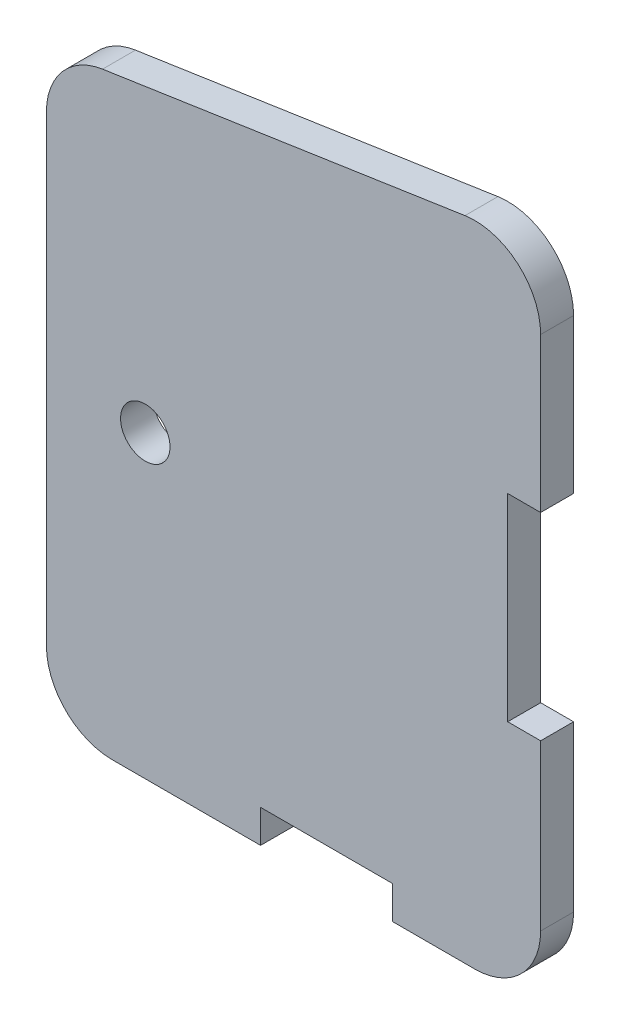
ISO-10303-21;
HEADER;
FILE_DESCRIPTION(('STEP AP214'),'2;1');
FILE_NAME('part.step','',(''),(''),'','','');
FILE_SCHEMA(('AUTOMOTIVE_DESIGN { 1 0 10303 214 1 1 1 1 }'));
ENDSEC;
DATA;
#1=APPLICATION_CONTEXT('core data for automotive mechanical design processes');
#2=APPLICATION_PROTOCOL_DEFINITION('international standard','automotive_design',2000,#1);
#3=PRODUCT_CONTEXT('',#1,'mechanical');
#4=PRODUCT('Part','Part','',(#3));
#5=PRODUCT_RELATED_PRODUCT_CATEGORY('part','',(#4));
#6=PRODUCT_DEFINITION_FORMATION('','',#4);
#7=PRODUCT_DEFINITION_CONTEXT('part definition',#1,'design');
#8=PRODUCT_DEFINITION('design','',#6,#7);
#9=PRODUCT_DEFINITION_SHAPE('','',#8);
#10=(LENGTH_UNIT() NAMED_UNIT(*) SI_UNIT(.MILLI.,.METRE.));
#11=(NAMED_UNIT(*) PLANE_ANGLE_UNIT() SI_UNIT($,.RADIAN.));
#12=(NAMED_UNIT(*) SI_UNIT($,.STERADIAN.) SOLID_ANGLE_UNIT());
#13=UNCERTAINTY_MEASURE_WITH_UNIT(LENGTH_MEASURE(1.E-05),#10,'distance_accuracy_value','');
#14=(GEOMETRIC_REPRESENTATION_CONTEXT(3) GLOBAL_UNCERTAINTY_ASSIGNED_CONTEXT((#13)) GLOBAL_UNIT_ASSIGNED_CONTEXT((#10,
#11,#12)) REPRESENTATION_CONTEXT('',''));
#15=CARTESIAN_POINT('',(0.,0.,0.));
#16=DIRECTION('',(0.,0.,1.));
#17=DIRECTION('',(1.,0.,0.));
#18=AXIS2_PLACEMENT_3D('',#15,#16,#17);
#19=CARTESIAN_POINT('',(-41.275,50.8877098778703,3.175));
#20=DIRECTION('',(0.,0.,-1.));
#21=DIRECTION('',(-1.,0.,0.));
#22=AXIS2_PLACEMENT_3D('',#19,#20,#21);
#23=CYLINDRICAL_SURFACE('',#22,6.35);
#24=CARTESIAN_POINT('',(-41.275,50.8877098778703,0.));
#25=DIRECTION('',(0.,0.,1.));
#26=DIRECTION('',(1.,0.,0.));
#27=AXIS2_PLACEMENT_3D('',#24,#25,#26);
#28=CIRCLE('',#27,6.35);
#29=CARTESIAN_POINT('',(-47.625,50.8877098778702,0.));
#30=VERTEX_POINT('',#29);
#31=CARTESIAN_POINT('',(-42.216961876107,57.1674557185839,0.));
#32=VERTEX_POINT('',#31);
#33=EDGE_CURVE('E182',#30,#32,#28,.F.);
#34=ORIENTED_EDGE('',*,*,#33,.F.);
#35=DIRECTION('',(0.,0.,-1.));
#36=VECTOR('',#35,1.);
#37=CARTESIAN_POINT('',(-47.625,50.8877098778702,3.175));
#38=LINE('',#37,#36);
#39=CARTESIAN_POINT('',(-47.625,50.8877098778702,3.175));
#40=VERTEX_POINT('',#39);
#41=EDGE_CURVE('E11',#40,#30,#38,.T.);
#42=ORIENTED_EDGE('',*,*,#41,.F.);
#43=CARTESIAN_POINT('',(-41.275,50.8877098778703,3.175));
#44=DIRECTION('',(0.,0.,1.));
#45=DIRECTION('',(1.,0.,0.));
#46=AXIS2_PLACEMENT_3D('',#43,#44,#45);
#47=CIRCLE('',#46,6.35);
#48=CARTESIAN_POINT('',(-42.216961876107,57.1674557185839,3.175));
#49=VERTEX_POINT('',#48);
#50=EDGE_CURVE('E328',#40,#49,#47,.F.);
#51=ORIENTED_EDGE('',*,*,#50,.T.);
#52=DIRECTION('',(0.,0.,-1.));
#53=VECTOR('',#52,1.);
#54=CARTESIAN_POINT('',(-42.216961876107,57.1674557185839,3.175));
#55=LINE('',#54,#53);
#56=EDGE_CURVE('E52',#49,#32,#55,.T.);
#57=ORIENTED_EDGE('',*,*,#56,.T.);
#58=EDGE_LOOP('',(#34,#42,#51,#57));
#59=FACE_BOUND('',#58,.T.);
#60=ADVANCED_FACE('F35',(#59),#23,.T.);
#61=CARTESIAN_POINT('',(-47.625,0.,3.175));
#62=DIRECTION('',(1.,0.,0.));
#63=DIRECTION('',(0.,1.,0.));
#64=AXIS2_PLACEMENT_3D('',#61,#62,#63);
#65=PLANE('',#64);
#66=DIRECTION('',(0.,-1.,0.));
#67=VECTOR('',#66,1.);
#68=CARTESIAN_POINT('',(-47.625,0.,0.));
#69=LINE('',#68,#67);
#70=CARTESIAN_POINT('',(-47.625,6.35000000000004,0.));
#71=VERTEX_POINT('',#70);
#72=EDGE_CURVE('E184',#30,#71,#69,.T.);
#73=ORIENTED_EDGE('',*,*,#72,.T.);
#74=DIRECTION('',(0.,0.,-1.));
#75=VECTOR('',#74,1.);
#76=CARTESIAN_POINT('',(-47.625,6.35000000000004,3.175));
#77=LINE('',#76,#75);
#78=CARTESIAN_POINT('',(-47.625,6.35000000000004,3.175));
#79=VERTEX_POINT('',#78);
#80=EDGE_CURVE('E44',#79,#71,#77,.T.);
#81=ORIENTED_EDGE('',*,*,#80,.F.);
#82=DIRECTION('',(0.,-1.,0.));
#83=VECTOR('',#82,1.);
#84=CARTESIAN_POINT('',(-47.625,0.,3.175));
#85=LINE('',#84,#83);
#86=EDGE_CURVE('E330',#40,#79,#85,.T.);
#87=ORIENTED_EDGE('',*,*,#86,.F.);
#88=ORIENTED_EDGE('',*,*,#41,.T.);
#89=EDGE_LOOP('',(#73,#81,#87,#88));
#90=FACE_BOUND('',#89,.T.);
#91=ADVANCED_FACE('F260',(#90),#65,.F.);
#92=CARTESIAN_POINT('',(-41.275,6.34999999999999,3.175));
#93=DIRECTION('',(0.,0.,-1.));
#94=DIRECTION('',(-1.,0.,0.));
#95=AXIS2_PLACEMENT_3D('',#92,#93,#94);
#96=CYLINDRICAL_SURFACE('',#95,6.35);
#97=CARTESIAN_POINT('',(-41.275,6.34999999999999,0.));
#98=DIRECTION('',(0.,0.,1.));
#99=DIRECTION('',(1.,0.,0.));
#100=AXIS2_PLACEMENT_3D('',#97,#98,#99);
#101=CIRCLE('',#100,6.35);
#102=CARTESIAN_POINT('',(-41.2749999999999,0.,0.));
#103=VERTEX_POINT('',#102);
#104=EDGE_CURVE('E187',#71,#103,#101,.T.);
#105=ORIENTED_EDGE('',*,*,#104,.T.);
#106=DIRECTION('',(0.,0.,-1.));
#107=VECTOR('',#106,1.);
#108=CARTESIAN_POINT('',(-41.2749999999999,0.,3.175));
#109=LINE('',#108,#107);
#110=CARTESIAN_POINT('',(-41.2749999999999,0.,3.175));
#111=VERTEX_POINT('',#110);
#112=EDGE_CURVE('E250',#111,#103,#109,.T.);
#113=ORIENTED_EDGE('',*,*,#112,.F.);
#114=CARTESIAN_POINT('',(-41.275,6.34999999999999,3.175));
#115=DIRECTION('',(0.,0.,1.));
#116=DIRECTION('',(1.,0.,0.));
#117=AXIS2_PLACEMENT_3D('',#114,#115,#116);
#118=CIRCLE('',#117,6.35);
#119=EDGE_CURVE('E256',#79,#111,#118,.T.);
#120=ORIENTED_EDGE('',*,*,#119,.F.);
#121=ORIENTED_EDGE('',*,*,#80,.T.);
#122=EDGE_LOOP('',(#105,#113,#120,#121));
#123=FACE_BOUND('',#122,.T.);
#124=ADVANCED_FACE('F254',(#123),#96,.T.);
#125=CARTESIAN_POINT('',(0.,0.,3.175));
#126=DIRECTION('',(0.,-1.,0.));
#127=DIRECTION('',(1.,0.,0.));
#128=AXIS2_PLACEMENT_3D('',#125,#126,#127);
#129=PLANE('',#128);
#130=DIRECTION('',(-1.,0.,0.));
#131=VECTOR('',#130,1.);
#132=CARTESIAN_POINT('',(0.,0.,0.));
#133=LINE('',#132,#131);
#134=CARTESIAN_POINT('',(-26.9875,0.,0.));
#135=VERTEX_POINT('',#134);
#136=EDGE_CURVE('E190',#135,#103,#133,.T.);
#137=ORIENTED_EDGE('',*,*,#136,.F.);
#138=DIRECTION('',(0.,0.,-1.));
#139=VECTOR('',#138,1.);
#140=CARTESIAN_POINT('',(-26.9875,0.,3.175));
#141=LINE('',#140,#139);
#142=CARTESIAN_POINT('',(-26.9875,0.,3.175));
#143=VERTEX_POINT('',#142);
#144=EDGE_CURVE('E248',#143,#135,#141,.T.);
#145=ORIENTED_EDGE('',*,*,#144,.F.);
#146=DIRECTION('',(-1.,0.,0.));
#147=VECTOR('',#146,1.);
#148=CARTESIAN_POINT('',(0.,0.,3.175));
#149=LINE('',#148,#147);
#150=EDGE_CURVE('E335',#143,#111,#149,.T.);
#151=ORIENTED_EDGE('',*,*,#150,.T.);
#152=ORIENTED_EDGE('',*,*,#112,.T.);
#153=EDGE_LOOP('',(#137,#145,#151,#152));
#154=FACE_BOUND('',#153,.T.);
#155=ADVANCED_FACE('F271',(#154),#129,.T.);
#156=CARTESIAN_POINT('',(-26.9875,0.,3.175));
#157=DIRECTION('',(-1.,0.,0.));
#158=DIRECTION('',(0.,0.,1.));
#159=AXIS2_PLACEMENT_3D('',#156,#157,#158);
#160=PLANE('',#159);
#161=DIRECTION('',(0.,1.,0.));
#162=VECTOR('',#161,1.);
#163=CARTESIAN_POINT('',(-26.9875,0.,0.));
#164=LINE('',#163,#162);
#165=CARTESIAN_POINT('',(-26.9875,3.175,0.));
#166=VERTEX_POINT('',#165);
#167=EDGE_CURVE('E193',#135,#166,#164,.T.);
#168=ORIENTED_EDGE('',*,*,#167,.T.);
#169=DIRECTION('',(0.,0.,-1.));
#170=VECTOR('',#169,1.);
#171=CARTESIAN_POINT('',(-26.9875,3.175,3.175));
#172=LINE('',#171,#170);
#173=CARTESIAN_POINT('',(-26.9875,3.175,3.175));
#174=VERTEX_POINT('',#173);
#175=EDGE_CURVE('E245',#174,#166,#172,.T.);
#176=ORIENTED_EDGE('',*,*,#175,.F.);
#177=DIRECTION('',(0.,1.,0.));
#178=VECTOR('',#177,1.);
#179=CARTESIAN_POINT('',(-26.9875,0.,3.175));
#180=LINE('',#179,#178);
#181=EDGE_CURVE('E338',#143,#174,#180,.T.);
#182=ORIENTED_EDGE('',*,*,#181,.F.);
#183=ORIENTED_EDGE('',*,*,#144,.T.);
#184=EDGE_LOOP('',(#168,#176,#182,#183));
#185=FACE_BOUND('',#184,.T.);
#186=ADVANCED_FACE('F274',(#185),#160,.F.);
#187=CARTESIAN_POINT('',(0.,3.17499999999999,3.175));
#188=DIRECTION('',(0.,1.,0.));
#189=DIRECTION('',(-1.,0.,0.));
#190=AXIS2_PLACEMENT_3D('',#187,#188,#189);
#191=PLANE('',#190);
#192=DIRECTION('',(1.,0.,0.));
#193=VECTOR('',#192,1.);
#194=CARTESIAN_POINT('',(0.,3.17499999999999,0.));
#195=LINE('',#194,#193);
#196=CARTESIAN_POINT('',(-14.2875,3.175,0.));
#197=VERTEX_POINT('',#196);
#198=EDGE_CURVE('E196',#166,#197,#195,.T.);
#199=ORIENTED_EDGE('',*,*,#198,.T.);
#200=DIRECTION('',(0.,0.,-1.));
#201=VECTOR('',#200,1.);
#202=CARTESIAN_POINT('',(-14.2875,3.175,3.175));
#203=LINE('',#202,#201);
#204=CARTESIAN_POINT('',(-14.2875,3.175,3.175));
#205=VERTEX_POINT('',#204);
#206=EDGE_CURVE('E243',#205,#197,#203,.T.);
#207=ORIENTED_EDGE('',*,*,#206,.F.);
#208=DIRECTION('',(1.,0.,0.));
#209=VECTOR('',#208,1.);
#210=CARTESIAN_POINT('',(0.,3.17499999999999,3.175));
#211=LINE('',#210,#209);
#212=EDGE_CURVE('E341',#174,#205,#211,.T.);
#213=ORIENTED_EDGE('',*,*,#212,.F.);
#214=ORIENTED_EDGE('',*,*,#175,.T.);
#215=EDGE_LOOP('',(#199,#207,#213,#214));
#216=FACE_BOUND('',#215,.T.);
#217=ADVANCED_FACE('F278',(#216),#191,.F.);
#218=CARTESIAN_POINT('',(-14.2875,0.,3.175));
#219=DIRECTION('',(-1.,0.,0.));
#220=DIRECTION('',(0.,0.,1.));
#221=AXIS2_PLACEMENT_3D('',#218,#219,#220);
#222=PLANE('',#221);
#223=DIRECTION('',(0.,1.,0.));
#224=VECTOR('',#223,1.);
#225=CARTESIAN_POINT('',(-14.2875,0.,0.));
#226=LINE('',#225,#224);
#227=CARTESIAN_POINT('',(-14.2875,0.,0.));
#228=VERTEX_POINT('',#227);
#229=EDGE_CURVE('E199',#228,#197,#226,.T.);
#230=ORIENTED_EDGE('',*,*,#229,.F.);
#231=DIRECTION('',(0.,0.,-1.));
#232=VECTOR('',#231,1.);
#233=CARTESIAN_POINT('',(-14.2875,0.,3.175));
#234=LINE('',#233,#232);
#235=CARTESIAN_POINT('',(-14.2875,0.,3.175));
#236=VERTEX_POINT('',#235);
#237=EDGE_CURVE('E241',#236,#228,#234,.T.);
#238=ORIENTED_EDGE('',*,*,#237,.F.);
#239=DIRECTION('',(0.,1.,0.));
#240=VECTOR('',#239,1.);
#241=CARTESIAN_POINT('',(-14.2875,0.,3.175));
#242=LINE('',#241,#240);
#243=EDGE_CURVE('E343',#236,#205,#242,.T.);
#244=ORIENTED_EDGE('',*,*,#243,.T.);
#245=ORIENTED_EDGE('',*,*,#206,.T.);
#246=EDGE_LOOP('',(#230,#238,#244,#245));
#247=FACE_BOUND('',#246,.T.);
#248=ADVANCED_FACE('F282',(#247),#222,.T.);
#249=CARTESIAN_POINT('',(0.,0.,3.175));
#250=DIRECTION('',(0.,-1.,0.));
#251=DIRECTION('',(1.,0.,0.));
#252=AXIS2_PLACEMENT_3D('',#249,#250,#251);
#253=PLANE('',#252);
#254=DIRECTION('',(-1.,0.,0.));
#255=VECTOR('',#254,1.);
#256=CARTESIAN_POINT('',(0.,0.,0.));
#257=LINE('',#256,#255);
#258=CARTESIAN_POINT('',(-6.35000000000004,0.,0.));
#259=VERTEX_POINT('',#258);
#260=EDGE_CURVE('E202',#259,#228,#257,.T.);
#261=ORIENTED_EDGE('',*,*,#260,.F.);
#262=DIRECTION('',(0.,0.,-1.));
#263=VECTOR('',#262,1.);
#264=CARTESIAN_POINT('',(-6.35000000000004,0.,3.175));
#265=LINE('',#264,#263);
#266=CARTESIAN_POINT('',(-6.35000000000004,0.,3.175));
#267=VERTEX_POINT('',#266);
#268=EDGE_CURVE('E239',#267,#259,#265,.T.);
#269=ORIENTED_EDGE('',*,*,#268,.F.);
#270=DIRECTION('',(-1.,0.,0.));
#271=VECTOR('',#270,1.);
#272=CARTESIAN_POINT('',(0.,0.,3.175));
#273=LINE('',#272,#271);
#274=EDGE_CURVE('E346',#267,#236,#273,.T.);
#275=ORIENTED_EDGE('',*,*,#274,.T.);
#276=ORIENTED_EDGE('',*,*,#237,.T.);
#277=EDGE_LOOP('',(#261,#269,#275,#276));
#278=FACE_BOUND('',#277,.T.);
#279=ADVANCED_FACE('F286',(#278),#253,.T.);
#280=CARTESIAN_POINT('',(-6.35,6.35,3.175));
#281=DIRECTION('',(0.,0.,-1.));
#282=DIRECTION('',(-1.,0.,0.));
#283=AXIS2_PLACEMENT_3D('',#280,#281,#282);
#284=CYLINDRICAL_SURFACE('',#283,6.35);
#285=CARTESIAN_POINT('',(-6.35,6.35,0.));
#286=DIRECTION('',(0.,0.,1.));
#287=DIRECTION('',(1.,0.,0.));
#288=AXIS2_PLACEMENT_3D('',#285,#286,#287);
#289=CIRCLE('',#288,6.35);
#290=CARTESIAN_POINT('',(0.,6.35000000000004,0.));
#291=VERTEX_POINT('',#290);
#292=EDGE_CURVE('E205',#291,#259,#289,.F.);
#293=ORIENTED_EDGE('',*,*,#292,.F.);
#294=DIRECTION('',(0.,0.,-1.));
#295=VECTOR('',#294,1.);
#296=CARTESIAN_POINT('',(0.,6.35000000000004,3.175));
#297=LINE('',#296,#295);
#298=CARTESIAN_POINT('',(0.,6.35000000000004,3.175));
#299=VERTEX_POINT('',#298);
#300=EDGE_CURVE('E237',#299,#291,#297,.T.);
#301=ORIENTED_EDGE('',*,*,#300,.F.);
#302=CARTESIAN_POINT('',(-6.35,6.35,3.175));
#303=DIRECTION('',(0.,0.,1.));
#304=DIRECTION('',(1.,0.,0.));
#305=AXIS2_PLACEMENT_3D('',#302,#303,#304);
#306=CIRCLE('',#305,6.35);
#307=EDGE_CURVE('E349',#299,#267,#306,.F.);
#308=ORIENTED_EDGE('',*,*,#307,.T.);
#309=ORIENTED_EDGE('',*,*,#268,.T.);
#310=EDGE_LOOP('',(#293,#301,#308,#309));
#311=FACE_BOUND('',#310,.T.);
#312=ADVANCED_FACE('F290',(#311),#284,.T.);
#313=CARTESIAN_POINT('',(0.,0.,3.175));
#314=DIRECTION('',(1.,0.,0.));
#315=DIRECTION('',(0.,1.,0.));
#316=AXIS2_PLACEMENT_3D('',#313,#314,#315);
#317=PLANE('',#316);
#318=DIRECTION('',(0.,-1.,0.));
#319=VECTOR('',#318,1.);
#320=CARTESIAN_POINT('',(0.,0.,0.));
#321=LINE('',#320,#319);
#322=CARTESIAN_POINT('',(0.,22.225,0.));
#323=VERTEX_POINT('',#322);
#324=EDGE_CURVE('E208',#323,#291,#321,.T.);
#325=ORIENTED_EDGE('',*,*,#324,.F.);
#326=DIRECTION('',(0.,0.,-1.));
#327=VECTOR('',#326,1.);
#328=CARTESIAN_POINT('',(0.,22.225,3.175));
#329=LINE('',#328,#327);
#330=CARTESIAN_POINT('',(0.,22.225,3.175));
#331=VERTEX_POINT('',#330);
#332=EDGE_CURVE('E235',#331,#323,#329,.T.);
#333=ORIENTED_EDGE('',*,*,#332,.F.);
#334=DIRECTION('',(0.,-1.,0.));
#335=VECTOR('',#334,1.);
#336=CARTESIAN_POINT('',(0.,0.,3.175));
#337=LINE('',#336,#335);
#338=EDGE_CURVE('E352',#331,#299,#337,.T.);
#339=ORIENTED_EDGE('',*,*,#338,.T.);
#340=ORIENTED_EDGE('',*,*,#300,.T.);
#341=EDGE_LOOP('',(#325,#333,#339,#340));
#342=FACE_BOUND('',#341,.T.);
#343=ADVANCED_FACE('F294',(#342),#317,.T.);
#344=CARTESIAN_POINT('',(0.,22.225,3.175));
#345=DIRECTION('',(0.,-1.,0.));
#346=DIRECTION('',(0.,0.,-1.));
#347=AXIS2_PLACEMENT_3D('',#344,#345,#346);
#348=PLANE('',#347);
#349=DIRECTION('',(-1.,0.,0.));
#350=VECTOR('',#349,1.);
#351=CARTESIAN_POINT('',(0.,22.225,0.));
#352=LINE('',#351,#350);
#353=CARTESIAN_POINT('',(-3.17499999999999,22.225,0.));
#354=VERTEX_POINT('',#353);
#355=EDGE_CURVE('E211',#323,#354,#352,.T.);
#356=ORIENTED_EDGE('',*,*,#355,.T.);
#357=DIRECTION('',(0.,0.,-1.));
#358=VECTOR('',#357,1.);
#359=CARTESIAN_POINT('',(-3.17499999999999,22.225,3.175));
#360=LINE('',#359,#358);
#361=CARTESIAN_POINT('',(-3.17499999999999,22.225,3.175));
#362=VERTEX_POINT('',#361);
#363=EDGE_CURVE('E232',#362,#354,#360,.T.);
#364=ORIENTED_EDGE('',*,*,#363,.F.);
#365=DIRECTION('',(-1.,0.,0.));
#366=VECTOR('',#365,1.);
#367=CARTESIAN_POINT('',(0.,22.225,3.175));
#368=LINE('',#367,#366);
#369=EDGE_CURVE('E355',#331,#362,#368,.T.);
#370=ORIENTED_EDGE('',*,*,#369,.F.);
#371=ORIENTED_EDGE('',*,*,#332,.T.);
#372=EDGE_LOOP('',(#356,#364,#370,#371));
#373=FACE_BOUND('',#372,.T.);
#374=ADVANCED_FACE('F298',(#373),#348,.F.);
#375=CARTESIAN_POINT('',(-3.17499999999999,0.,3.175));
#376=DIRECTION('',(-1.,0.,0.));
#377=DIRECTION('',(0.,0.,1.));
#378=AXIS2_PLACEMENT_3D('',#375,#376,#377);
#379=PLANE('',#378);
#380=DIRECTION('',(0.,1.,0.));
#381=VECTOR('',#380,1.);
#382=CARTESIAN_POINT('',(-3.17499999999999,0.,0.));
#383=LINE('',#382,#381);
#384=CARTESIAN_POINT('',(-3.17499999999999,41.275,0.));
#385=VERTEX_POINT('',#384);
#386=EDGE_CURVE('E214',#354,#385,#383,.T.);
#387=ORIENTED_EDGE('',*,*,#386,.T.);
#388=DIRECTION('',(0.,0.,-1.));
#389=VECTOR('',#388,1.);
#390=CARTESIAN_POINT('',(-3.17499999999999,41.275,3.175));
#391=LINE('',#390,#389);
#392=CARTESIAN_POINT('',(-3.17499999999999,41.275,3.175));
#393=VERTEX_POINT('',#392);
#394=EDGE_CURVE('E230',#393,#385,#391,.T.);
#395=ORIENTED_EDGE('',*,*,#394,.F.);
#396=DIRECTION('',(0.,1.,0.));
#397=VECTOR('',#396,1.);
#398=CARTESIAN_POINT('',(-3.17499999999999,0.,3.175));
#399=LINE('',#398,#397);
#400=EDGE_CURVE('E174',#362,#393,#399,.T.);
#401=ORIENTED_EDGE('',*,*,#400,.F.);
#402=ORIENTED_EDGE('',*,*,#363,.T.);
#403=EDGE_LOOP('',(#387,#395,#401,#402));
#404=FACE_BOUND('',#403,.T.);
#405=ADVANCED_FACE('F302',(#404),#379,.F.);
#406=CARTESIAN_POINT('',(0.,41.275,3.175));
#407=DIRECTION('',(0.,-1.,0.));
#408=DIRECTION('',(1.,0.,0.));
#409=AXIS2_PLACEMENT_3D('',#406,#407,#408);
#410=PLANE('',#409);
#411=DIRECTION('',(-1.,0.,0.));
#412=VECTOR('',#411,1.);
#413=CARTESIAN_POINT('',(0.,41.275,0.));
#414=LINE('',#413,#412);
#415=CARTESIAN_POINT('',(0.,41.275,0.));
#416=VERTEX_POINT('',#415);
#417=EDGE_CURVE('E217',#416,#385,#414,.T.);
#418=ORIENTED_EDGE('',*,*,#417,.F.);
#419=DIRECTION('',(0.,0.,-1.));
#420=VECTOR('',#419,1.);
#421=CARTESIAN_POINT('',(0.,41.275,3.175));
#422=LINE('',#421,#420);
#423=CARTESIAN_POINT('',(0.,41.275,3.175));
#424=VERTEX_POINT('',#423);
#425=EDGE_CURVE('E160',#424,#416,#422,.T.);
#426=ORIENTED_EDGE('',*,*,#425,.F.);
#427=DIRECTION('',(-1.,0.,0.));
#428=VECTOR('',#427,1.);
#429=CARTESIAN_POINT('',(0.,41.275,3.175));
#430=LINE('',#429,#428);
#431=EDGE_CURVE('E172',#424,#393,#430,.T.);
#432=ORIENTED_EDGE('',*,*,#431,.T.);
#433=ORIENTED_EDGE('',*,*,#394,.T.);
#434=EDGE_LOOP('',(#418,#426,#432,#433));
#435=FACE_BOUND('',#434,.T.);
#436=ADVANCED_FACE('F306',(#435),#410,.T.);
#437=CARTESIAN_POINT('',(0.,0.,3.175));
#438=DIRECTION('',(1.,0.,0.));
#439=DIRECTION('',(0.,1.,0.));
#440=AXIS2_PLACEMENT_3D('',#437,#438,#439);
#441=PLANE('',#440);
#442=DIRECTION('',(0.,-1.,0.));
#443=VECTOR('',#442,1.);
#444=CARTESIAN_POINT('',(0.,0.,0.));
#445=LINE('',#444,#443);
#446=CARTESIAN_POINT('',(0.,56.1264598778702,0.));
#447=VERTEX_POINT('',#446);
#448=EDGE_CURVE('E157',#447,#416,#445,.T.);
#449=ORIENTED_EDGE('',*,*,#448,.F.);
#450=DIRECTION('',(0.,0.,-1.));
#451=VECTOR('',#450,1.);
#452=CARTESIAN_POINT('',(0.,56.1264598778702,3.175));
#453=LINE('',#452,#451);
#454=CARTESIAN_POINT('',(0.,56.1264598778702,3.175));
#455=VERTEX_POINT('',#454);
#456=EDGE_CURVE('E151',#455,#447,#453,.T.);
#457=ORIENTED_EDGE('',*,*,#456,.F.);
#458=DIRECTION('',(0.,-1.,0.));
#459=VECTOR('',#458,1.);
#460=CARTESIAN_POINT('',(0.,0.,3.175));
#461=LINE('',#460,#459);
#462=EDGE_CURVE('E155',#455,#424,#461,.T.);
#463=ORIENTED_EDGE('',*,*,#462,.T.);
#464=ORIENTED_EDGE('',*,*,#425,.T.);
#465=EDGE_LOOP('',(#449,#457,#463,#464));
#466=FACE_BOUND('',#465,.T.);
#467=ADVANCED_FACE('F153',(#466),#441,.T.);
#468=CARTESIAN_POINT('',(-6.35,56.1264598778703,3.175));
#469=DIRECTION('',(0.,0.,-1.));
#470=DIRECTION('',(-1.,0.,0.));
#471=AXIS2_PLACEMENT_3D('',#468,#469,#470);
#472=CYLINDRICAL_SURFACE('',#471,6.35);
#473=CARTESIAN_POINT('',(-6.35,56.1264598778703,0.));
#474=DIRECTION('',(0.,0.,1.));
#475=DIRECTION('',(1.,0.,0.));
#476=AXIS2_PLACEMENT_3D('',#473,#474,#475);
#477=CIRCLE('',#476,6.35);
#478=CARTESIAN_POINT('',(-7.29196187610711,62.4062057185839,0.));
#479=VERTEX_POINT('',#478);
#480=EDGE_CURVE('E221',#447,#479,#477,.T.);
#481=ORIENTED_EDGE('',*,*,#480,.T.);
#482=DIRECTION('',(0.,0.,-1.));
#483=VECTOR('',#482,1.);
#484=CARTESIAN_POINT('',(-7.29196187610711,62.4062057185839,3.175));
#485=LINE('',#484,#483);
#486=CARTESIAN_POINT('',(-7.29196187610711,62.4062057185839,3.175));
#487=VERTEX_POINT('',#486);
#488=EDGE_CURVE('E102',#487,#479,#485,.T.);
#489=ORIENTED_EDGE('',*,*,#488,.F.);
#490=CARTESIAN_POINT('',(-6.35,56.1264598778703,3.175));
#491=DIRECTION('',(0.,0.,1.));
#492=DIRECTION('',(1.,0.,0.));
#493=AXIS2_PLACEMENT_3D('',#490,#491,#492);
#494=CIRCLE('',#493,6.35);
#495=EDGE_CURVE('E162',#455,#487,#494,.T.);
#496=ORIENTED_EDGE('',*,*,#495,.F.);
#497=ORIENTED_EDGE('',*,*,#456,.T.);
#498=EDGE_LOOP('',(#481,#489,#496,#497));
#499=FACE_BOUND('',#498,.T.);
#500=ADVANCED_FACE('F163',(#499),#472,.T.);
#501=CARTESIAN_POINT('',(-38.1,28.8925,3.175));
#502=DIRECTION('',(0.,0.,-1.));
#503=DIRECTION('',(-1.,0.,0.));
#504=AXIS2_PLACEMENT_3D('',#501,#502,#503);
#505=CYLINDRICAL_SURFACE('',#504,2.38125);
#506=CARTESIAN_POINT('',(-38.1,28.8925,3.175));
#507=DIRECTION('',(0.,0.,1.));
#508=DIRECTION('',(1.,0.,0.));
#509=AXIS2_PLACEMENT_3D('',#506,#507,#508);
#510=CIRCLE('',#509,2.38125);
#511=CARTESIAN_POINT('',(-35.71875,28.8925,3.175));
#512=VERTEX_POINT('',#511);
#513=EDGE_CURVE('E226',#512,#512,#510,.T.);
#514=ORIENTED_EDGE('',*,*,#513,.T.);
#515=EDGE_LOOP('',(#514));
#516=FACE_BOUND('',#515,.T.);
#517=CARTESIAN_POINT('',(-38.1,28.8925,0.));
#518=DIRECTION('',(0.,0.,1.));
#519=DIRECTION('',(1.,0.,0.));
#520=AXIS2_PLACEMENT_3D('',#517,#518,#519);
#521=CIRCLE('',#520,2.38125);
#522=CARTESIAN_POINT('',(-35.71875,28.8925,0.));
#523=VERTEX_POINT('',#522);
#524=EDGE_CURVE('E179',#523,#523,#521,.T.);
#525=ORIENTED_EDGE('',*,*,#524,.F.);
#526=EDGE_LOOP('',(#525));
#527=FACE_BOUND('',#526,.T.);
#528=ADVANCED_FACE('F37',(#516,#527),#505,.F.);
#529=CARTESIAN_POINT('',(-9.31540342298289,62.1026894865526,3.175));
#530=DIRECTION('',(-0.148340452930245,0.988936352868297,0.));
#531=DIRECTION('',(-0.988936352868298,-0.148340452930245,0.));
#532=AXIS2_PLACEMENT_3D('',#529,#530,#531);
#533=PLANE('',#532);
#534=DIRECTION('',(0.988936352868298,0.148340452930245,0.));
#535=VECTOR('',#534,1.);
#536=CARTESIAN_POINT('',(-9.31540342298289,62.1026894865526,0.));
#537=LINE('',#536,#535);
#538=EDGE_CURVE('E223',#32,#479,#537,.T.);
#539=ORIENTED_EDGE('',*,*,#538,.F.);
#540=ORIENTED_EDGE('',*,*,#56,.F.);
#541=DIRECTION('',(0.988936352868298,0.148340452930245,0.));
#542=VECTOR('',#541,1.);
#543=CARTESIAN_POINT('',(-9.31540342298289,62.1026894865526,3.175));
#544=LINE('',#543,#542);
#545=EDGE_CURVE('E166',#49,#487,#544,.T.);
#546=ORIENTED_EDGE('',*,*,#545,.T.);
#547=ORIENTED_EDGE('',*,*,#488,.T.);
#548=EDGE_LOOP('',(#539,#540,#546,#547));
#549=FACE_BOUND('',#548,.T.);
#550=ADVANCED_FACE('F315',(#549),#533,.T.);
#551=CARTESIAN_POINT('',(0.,0.,3.175));
#552=DIRECTION('',(0.,0.,1.));
#553=DIRECTION('',(1.,0.,0.));
#554=AXIS2_PLACEMENT_3D('',#551,#552,#553);
#555=PLANE('',#554);
#556=ORIENTED_EDGE('',*,*,#513,.F.);
#557=EDGE_LOOP('',(#556));
#558=FACE_BOUND('',#557,.T.);
#559=ORIENTED_EDGE('',*,*,#50,.F.);
#560=ORIENTED_EDGE('',*,*,#86,.T.);
#561=ORIENTED_EDGE('',*,*,#119,.T.);
#562=ORIENTED_EDGE('',*,*,#150,.F.);
#563=ORIENTED_EDGE('',*,*,#181,.T.);
#564=ORIENTED_EDGE('',*,*,#212,.T.);
#565=ORIENTED_EDGE('',*,*,#243,.F.);
#566=ORIENTED_EDGE('',*,*,#274,.F.);
#567=ORIENTED_EDGE('',*,*,#307,.F.);
#568=ORIENTED_EDGE('',*,*,#338,.F.);
#569=ORIENTED_EDGE('',*,*,#369,.T.);
#570=ORIENTED_EDGE('',*,*,#400,.T.);
#571=ORIENTED_EDGE('',*,*,#431,.F.);
#572=ORIENTED_EDGE('',*,*,#462,.F.);
#573=ORIENTED_EDGE('',*,*,#495,.T.);
#574=ORIENTED_EDGE('',*,*,#545,.F.);
#575=EDGE_LOOP('',(#559,#560,#561,#562,#563,#564,#565,#566,#567,#568,#569,#570,#571,#572,#573,#574));
#576=FACE_BOUND('',#575,.T.);
#577=ADVANCED_FACE('F170',(#558,#576),#555,.T.);
#578=CARTESIAN_POINT('',(0.,0.,0.));
#579=DIRECTION('',(0.,0.,1.));
#580=DIRECTION('',(1.,0.,0.));
#581=AXIS2_PLACEMENT_3D('',#578,#579,#580);
#582=PLANE('',#581);
#583=ORIENTED_EDGE('',*,*,#524,.T.);
#584=EDGE_LOOP('',(#583));
#585=FACE_BOUND('',#584,.T.);
#586=ORIENTED_EDGE('',*,*,#33,.T.);
#587=ORIENTED_EDGE('',*,*,#538,.T.);
#588=ORIENTED_EDGE('',*,*,#480,.F.);
#589=ORIENTED_EDGE('',*,*,#448,.T.);
#590=ORIENTED_EDGE('',*,*,#417,.T.);
#591=ORIENTED_EDGE('',*,*,#386,.F.);
#592=ORIENTED_EDGE('',*,*,#355,.F.);
#593=ORIENTED_EDGE('',*,*,#324,.T.);
#594=ORIENTED_EDGE('',*,*,#292,.T.);
#595=ORIENTED_EDGE('',*,*,#260,.T.);
#596=ORIENTED_EDGE('',*,*,#229,.T.);
#597=ORIENTED_EDGE('',*,*,#198,.F.);
#598=ORIENTED_EDGE('',*,*,#167,.F.);
#599=ORIENTED_EDGE('',*,*,#136,.T.);
#600=ORIENTED_EDGE('',*,*,#104,.F.);
#601=ORIENTED_EDGE('',*,*,#72,.F.);
#602=EDGE_LOOP('',(#586,#587,#588,#589,#590,#591,#592,#593,#594,#595,#596,#597,#598,#599,#600,#601));
#603=FACE_BOUND('',#602,.T.);
#604=ADVANCED_FACE('F262',(#585,#603),#582,.F.);
#605=CLOSED_SHELL('',(#60,#91,#124,#155,#186,#217,#248,#279,#312,#343,#374,#405,#436,#467,#500,
#528,#550,#577,#604));
#606=MANIFOLD_SOLID_BREP('B2',#605);
#607=ADVANCED_BREP_SHAPE_REPRESENTATION('',(#18,#606),#14);
#608=SHAPE_DEFINITION_REPRESENTATION(#9,#607);
ENDSEC;
END-ISO-10303-21;
